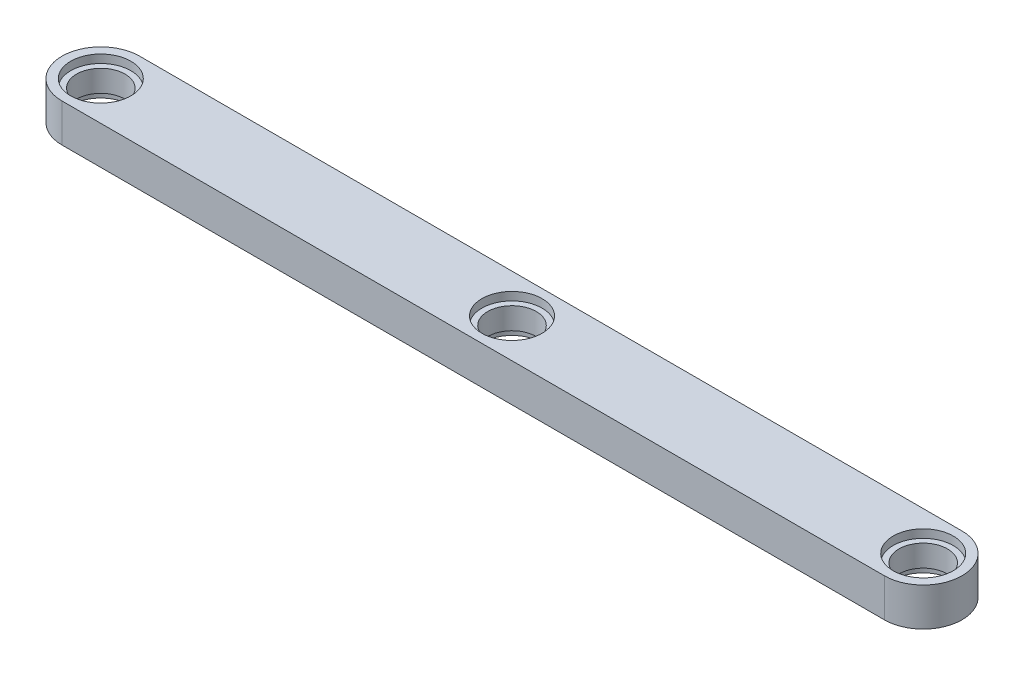
ISO-10303-21;
HEADER;
FILE_DESCRIPTION(('STEP AP214'),'2;1');
FILE_NAME('part.step','',(''),(''),'','','');
FILE_SCHEMA(('AUTOMOTIVE_DESIGN { 1 0 10303 214 1 1 1 1 }'));
ENDSEC;
DATA;
#1=APPLICATION_CONTEXT('core data for automotive mechanical design processes');
#2=APPLICATION_PROTOCOL_DEFINITION('international standard','automotive_design',2000,#1);
#3=PRODUCT_CONTEXT('',#1,'mechanical');
#4=PRODUCT('Part','Part','',(#3));
#5=PRODUCT_RELATED_PRODUCT_CATEGORY('part','',(#4));
#6=PRODUCT_DEFINITION_FORMATION('','',#4);
#7=PRODUCT_DEFINITION_CONTEXT('part definition',#1,'design');
#8=PRODUCT_DEFINITION('design','',#6,#7);
#9=PRODUCT_DEFINITION_SHAPE('','',#8);
#10=(LENGTH_UNIT() NAMED_UNIT(*) SI_UNIT(.MILLI.,.METRE.));
#11=(NAMED_UNIT(*) PLANE_ANGLE_UNIT() SI_UNIT($,.RADIAN.));
#12=(NAMED_UNIT(*) SI_UNIT($,.STERADIAN.) SOLID_ANGLE_UNIT());
#13=UNCERTAINTY_MEASURE_WITH_UNIT(LENGTH_MEASURE(1.E-05),#10,'distance_accuracy_value','');
#14=(GEOMETRIC_REPRESENTATION_CONTEXT(3) GLOBAL_UNCERTAINTY_ASSIGNED_CONTEXT((#13)) GLOBAL_UNIT_ASSIGNED_CONTEXT((#10,
#11,#12)) REPRESENTATION_CONTEXT('',''));
#15=CARTESIAN_POINT('',(0.,0.,0.));
#16=DIRECTION('',(0.,0.,1.));
#17=DIRECTION('',(1.,0.,0.));
#18=AXIS2_PLACEMENT_3D('',#15,#16,#17);
#19=CARTESIAN_POINT('',(0.,3.935,0.));
#20=DIRECTION('',(0.,-1.,0.));
#21=DIRECTION('',(0.,0.,-1.));
#22=AXIS2_PLACEMENT_3D('',#19,#20,#21);
#23=CYLINDRICAL_SURFACE('',#22,3.1);
#24=CARTESIAN_POINT('',(0.,0.,0.));
#25=DIRECTION('',(0.,1.,0.));
#26=DIRECTION('',(0.,0.,1.));
#27=AXIS2_PLACEMENT_3D('',#24,#25,#26);
#28=CIRCLE('',#27,3.1);
#29=CARTESIAN_POINT('',(0.,0.,3.1));
#30=VERTEX_POINT('',#29);
#31=EDGE_CURVE('E117',#30,#30,#28,.T.);
#32=ORIENTED_EDGE('',*,*,#31,.F.);
#33=EDGE_LOOP('',(#32));
#34=FACE_BOUND('',#33,.T.);
#35=CARTESIAN_POINT('',(0.,0.85,0.));
#36=DIRECTION('',(0.,1.,0.));
#37=DIRECTION('',(0.,0.,1.));
#38=AXIS2_PLACEMENT_3D('',#35,#36,#37);
#39=CIRCLE('',#38,3.1);
#40=CARTESIAN_POINT('',(0.,0.85,3.1));
#41=VERTEX_POINT('',#40);
#42=EDGE_CURVE('E175',#41,#41,#39,.T.);
#43=ORIENTED_EDGE('',*,*,#42,.T.);
#44=EDGE_LOOP('',(#43));
#45=FACE_BOUND('',#44,.T.);
#46=ADVANCED_FACE('F43',(#34,#45),#23,.F.);
#47=CARTESIAN_POINT('',(84.76,3.935,0.));
#48=DIRECTION('',(0.,-1.,0.));
#49=DIRECTION('',(0.,0.,-1.));
#50=AXIS2_PLACEMENT_3D('',#47,#48,#49);
#51=CYLINDRICAL_SURFACE('',#50,3.1);
#52=CARTESIAN_POINT('',(84.76,0.,0.));
#53=DIRECTION('',(0.,1.,0.));
#54=DIRECTION('',(0.,0.,1.));
#55=AXIS2_PLACEMENT_3D('',#52,#53,#54);
#56=CIRCLE('',#55,3.1);
#57=CARTESIAN_POINT('',(84.76,0.,3.1));
#58=VERTEX_POINT('',#57);
#59=EDGE_CURVE('E114',#58,#58,#56,.T.);
#60=ORIENTED_EDGE('',*,*,#59,.F.);
#61=EDGE_LOOP('',(#60));
#62=FACE_BOUND('',#61,.T.);
#63=CARTESIAN_POINT('',(84.76,0.85,0.));
#64=DIRECTION('',(0.,1.,0.));
#65=DIRECTION('',(0.,0.,1.));
#66=AXIS2_PLACEMENT_3D('',#63,#64,#65);
#67=CIRCLE('',#66,3.1);
#68=CARTESIAN_POINT('',(84.76,0.85,3.1));
#69=VERTEX_POINT('',#68);
#70=EDGE_CURVE('E167',#69,#69,#67,.T.);
#71=ORIENTED_EDGE('',*,*,#70,.T.);
#72=EDGE_LOOP('',(#71));
#73=FACE_BOUND('',#72,.T.);
#74=ADVANCED_FACE('F142',(#62,#73),#51,.F.);
#75=CARTESIAN_POINT('',(42.38,3.935,0.));
#76=DIRECTION('',(0.,-1.,0.));
#77=DIRECTION('',(0.,0.,-1.));
#78=AXIS2_PLACEMENT_3D('',#75,#76,#77);
#79=CYLINDRICAL_SURFACE('',#78,3.09999999999999);
#80=CARTESIAN_POINT('',(42.38,0.,0.));
#81=DIRECTION('',(0.,1.,0.));
#82=DIRECTION('',(0.,0.,1.));
#83=AXIS2_PLACEMENT_3D('',#80,#81,#82);
#84=CIRCLE('',#83,3.09999999999999);
#85=CARTESIAN_POINT('',(42.38,0.,3.09999999999999));
#86=VERTEX_POINT('',#85);
#87=EDGE_CURVE('E109',#86,#86,#84,.T.);
#88=ORIENTED_EDGE('',*,*,#87,.F.);
#89=EDGE_LOOP('',(#88));
#90=FACE_BOUND('',#89,.T.);
#91=CARTESIAN_POINT('',(42.38,0.85,0.));
#92=DIRECTION('',(0.,1.,0.));
#93=DIRECTION('',(0.,0.,1.));
#94=AXIS2_PLACEMENT_3D('',#91,#92,#93);
#95=CIRCLE('',#94,3.09999999999999);
#96=CARTESIAN_POINT('',(42.38,0.85,3.09999999999999));
#97=VERTEX_POINT('',#96);
#98=EDGE_CURVE('E160',#97,#97,#95,.T.);
#99=ORIENTED_EDGE('',*,*,#98,.T.);
#100=EDGE_LOOP('',(#99));
#101=FACE_BOUND('',#100,.T.);
#102=ADVANCED_FACE('F223',(#90,#101),#79,.F.);
#103=CARTESIAN_POINT('',(0.,3.935,4.));
#104=DIRECTION('',(0.,0.,-1.));
#105=DIRECTION('',(-1.,0.,0.));
#106=AXIS2_PLACEMENT_3D('',#103,#104,#105);
#107=PLANE('',#106);
#108=DIRECTION('',(1.,0.,0.));
#109=VECTOR('',#108,1.);
#110=CARTESIAN_POINT('',(0.,0.,4.));
#111=LINE('',#110,#109);
#112=CARTESIAN_POINT('',(0.,0.,4.));
#113=VERTEX_POINT('',#112);
#114=CARTESIAN_POINT('',(84.76,0.,4.));
#115=VERTEX_POINT('',#114);
#116=EDGE_CURVE('E120',#113,#115,#111,.T.);
#117=ORIENTED_EDGE('',*,*,#116,.T.);
#118=DIRECTION('',(0.,-1.,0.));
#119=VECTOR('',#118,1.);
#120=CARTESIAN_POINT('',(84.76,3.935,4.));
#121=LINE('',#120,#119);
#122=CARTESIAN_POINT('',(84.76,3.935,4.));
#123=VERTEX_POINT('',#122);
#124=EDGE_CURVE('E105',#123,#115,#121,.T.);
#125=ORIENTED_EDGE('',*,*,#124,.F.);
#126=DIRECTION('',(1.,0.,0.));
#127=VECTOR('',#126,1.);
#128=CARTESIAN_POINT('',(0.,3.935,4.));
#129=LINE('',#128,#127);
#130=CARTESIAN_POINT('',(0.,3.935,4.));
#131=VERTEX_POINT('',#130);
#132=EDGE_CURVE('E95',#131,#123,#129,.T.);
#133=ORIENTED_EDGE('',*,*,#132,.F.);
#134=DIRECTION('',(0.,-1.,0.));
#135=VECTOR('',#134,1.);
#136=CARTESIAN_POINT('',(0.,3.935,4.));
#137=LINE('',#136,#135);
#138=EDGE_CURVE('E106',#131,#113,#137,.T.);
#139=ORIENTED_EDGE('',*,*,#138,.T.);
#140=EDGE_LOOP('',(#117,#125,#133,#139));
#141=FACE_BOUND('',#140,.T.);
#142=ADVANCED_FACE('F228',(#141),#107,.F.);
#143=CARTESIAN_POINT('',(84.76,3.935,0.));
#144=DIRECTION('',(0.,-1.,0.));
#145=DIRECTION('',(0.,0.,-1.));
#146=AXIS2_PLACEMENT_3D('',#143,#144,#145);
#147=CYLINDRICAL_SURFACE('',#146,4.);
#148=CARTESIAN_POINT('',(84.76,0.,0.));
#149=DIRECTION('',(0.,1.,0.));
#150=DIRECTION('',(0.,0.,1.));
#151=AXIS2_PLACEMENT_3D('',#148,#149,#150);
#152=CIRCLE('',#151,4.);
#153=CARTESIAN_POINT('',(84.76,0.,-4.));
#154=VERTEX_POINT('',#153);
#155=EDGE_CURVE('E98',#115,#154,#152,.T.);
#156=ORIENTED_EDGE('',*,*,#155,.T.);
#157=DIRECTION('',(0.,-1.,0.));
#158=VECTOR('',#157,1.);
#159=CARTESIAN_POINT('',(84.76,3.935,-4.));
#160=LINE('',#159,#158);
#161=CARTESIAN_POINT('',(84.76,3.935,-4.));
#162=VERTEX_POINT('',#161);
#163=EDGE_CURVE('E96',#162,#154,#160,.T.);
#164=ORIENTED_EDGE('',*,*,#163,.F.);
#165=CARTESIAN_POINT('',(84.76,3.935,0.));
#166=DIRECTION('',(0.,1.,0.));
#167=DIRECTION('',(0.,0.,1.));
#168=AXIS2_PLACEMENT_3D('',#165,#166,#167);
#169=CIRCLE('',#168,4.);
#170=EDGE_CURVE('E87',#123,#162,#169,.T.);
#171=ORIENTED_EDGE('',*,*,#170,.F.);
#172=ORIENTED_EDGE('',*,*,#124,.T.);
#173=EDGE_LOOP('',(#156,#164,#171,#172));
#174=FACE_BOUND('',#173,.T.);
#175=ADVANCED_FACE('F100',(#174),#147,.T.);
#176=CARTESIAN_POINT('',(0.,3.935,-4.));
#177=DIRECTION('',(0.,0.,-1.));
#178=DIRECTION('',(-1.,0.,0.));
#179=AXIS2_PLACEMENT_3D('',#176,#177,#178);
#180=PLANE('',#179);
#181=DIRECTION('',(1.,0.,0.));
#182=VECTOR('',#181,1.);
#183=CARTESIAN_POINT('',(0.,0.,-4.));
#184=LINE('',#183,#182);
#185=CARTESIAN_POINT('',(0.,0.,-4.));
#186=VERTEX_POINT('',#185);
#187=EDGE_CURVE('E124',#186,#154,#184,.T.);
#188=ORIENTED_EDGE('',*,*,#187,.F.);
#189=DIRECTION('',(0.,-1.,0.));
#190=VECTOR('',#189,1.);
#191=CARTESIAN_POINT('',(0.,3.935,-4.));
#192=LINE('',#191,#190);
#193=CARTESIAN_POINT('',(0.,3.935,-4.));
#194=VERTEX_POINT('',#193);
#195=EDGE_CURVE('E76',#194,#186,#192,.T.);
#196=ORIENTED_EDGE('',*,*,#195,.F.);
#197=DIRECTION('',(1.,0.,0.));
#198=VECTOR('',#197,1.);
#199=CARTESIAN_POINT('',(0.,3.935,-4.));
#200=LINE('',#199,#198);
#201=EDGE_CURVE('E89',#194,#162,#200,.T.);
#202=ORIENTED_EDGE('',*,*,#201,.T.);
#203=ORIENTED_EDGE('',*,*,#163,.T.);
#204=EDGE_LOOP('',(#188,#196,#202,#203));
#205=FACE_BOUND('',#204,.T.);
#206=ADVANCED_FACE('F102',(#205),#180,.T.);
#207=CARTESIAN_POINT('',(0.,3.085,0.));
#208=DIRECTION('',(0.,1.,0.));
#209=DIRECTION('',(0.,0.,1.));
#210=AXIS2_PLACEMENT_3D('',#207,#208,#209);
#211=CIRCLE('',#210,3.1);
#212=CARTESIAN_POINT('',(0.,3.085,3.1));
#213=VERTEX_POINT('',#212);
#214=EDGE_CURVE('E12',#213,#213,#211,.T.);
#215=ORIENTED_EDGE('',*,*,#214,.F.);
#216=EDGE_LOOP('',(#215));
#217=FACE_BOUND('',#216,.T.);
#218=CARTESIAN_POINT('',(0.,3.935,0.));
#219=DIRECTION('',(0.,1.,0.));
#220=DIRECTION('',(0.,0.,1.));
#221=AXIS2_PLACEMENT_3D('',#218,#219,#220);
#222=CIRCLE('',#221,3.1);
#223=CARTESIAN_POINT('',(0.,3.935,3.1));
#224=VERTEX_POINT('',#223);
#225=EDGE_CURVE('E150',#224,#224,#222,.T.);
#226=ORIENTED_EDGE('',*,*,#225,.T.);
#227=EDGE_LOOP('',(#226));
#228=FACE_BOUND('',#227,.T.);
#229=ADVANCED_FACE('F143',(#217,#228),#23,.F.);
#230=CARTESIAN_POINT('',(84.76,3.085,0.));
#231=DIRECTION('',(0.,1.,0.));
#232=DIRECTION('',(0.,0.,1.));
#233=AXIS2_PLACEMENT_3D('',#230,#231,#232);
#234=CIRCLE('',#233,3.1);
#235=CARTESIAN_POINT('',(84.76,3.085,3.1));
#236=VERTEX_POINT('',#235);
#237=EDGE_CURVE('E55',#236,#236,#234,.T.);
#238=ORIENTED_EDGE('',*,*,#237,.F.);
#239=EDGE_LOOP('',(#238));
#240=FACE_BOUND('',#239,.T.);
#241=CARTESIAN_POINT('',(84.76,3.935,0.));
#242=DIRECTION('',(0.,1.,0.));
#243=DIRECTION('',(0.,0.,1.));
#244=AXIS2_PLACEMENT_3D('',#241,#242,#243);
#245=CIRCLE('',#244,3.1);
#246=CARTESIAN_POINT('',(84.76,3.935,3.1));
#247=VERTEX_POINT('',#246);
#248=EDGE_CURVE('E144',#247,#247,#245,.T.);
#249=ORIENTED_EDGE('',*,*,#248,.T.);
#250=EDGE_LOOP('',(#249));
#251=FACE_BOUND('',#250,.T.);
#252=ADVANCED_FACE('F136',(#240,#251),#51,.F.);
#253=CARTESIAN_POINT('',(42.38,3.085,0.));
#254=DIRECTION('',(0.,1.,0.));
#255=DIRECTION('',(0.,0.,1.));
#256=AXIS2_PLACEMENT_3D('',#253,#254,#255);
#257=CIRCLE('',#256,3.09999999999999);
#258=CARTESIAN_POINT('',(42.38,3.085,3.09999999999999));
#259=VERTEX_POINT('',#258);
#260=EDGE_CURVE('E131',#259,#259,#257,.T.);
#261=ORIENTED_EDGE('',*,*,#260,.F.);
#262=EDGE_LOOP('',(#261));
#263=FACE_BOUND('',#262,.T.);
#264=CARTESIAN_POINT('',(42.38,3.935,0.));
#265=DIRECTION('',(0.,1.,0.));
#266=DIRECTION('',(0.,0.,1.));
#267=AXIS2_PLACEMENT_3D('',#264,#265,#266);
#268=CIRCLE('',#267,3.09999999999999);
#269=CARTESIAN_POINT('',(42.38,3.935,3.09999999999999));
#270=VERTEX_POINT('',#269);
#271=EDGE_CURVE('E130',#270,#270,#268,.T.);
#272=ORIENTED_EDGE('',*,*,#271,.T.);
#273=EDGE_LOOP('',(#272));
#274=FACE_BOUND('',#273,.T.);
#275=ADVANCED_FACE('F44',(#263,#274),#79,.F.);
#276=CARTESIAN_POINT('',(0.,3.935,0.));
#277=DIRECTION('',(0.,-1.,0.));
#278=DIRECTION('',(0.,0.,-1.));
#279=AXIS2_PLACEMENT_3D('',#276,#277,#278);
#280=CYLINDRICAL_SURFACE('',#279,4.);
#281=CARTESIAN_POINT('',(0.,0.,0.));
#282=DIRECTION('',(0.,1.,0.));
#283=DIRECTION('',(0.,0.,1.));
#284=AXIS2_PLACEMENT_3D('',#281,#282,#283);
#285=CIRCLE('',#284,4.);
#286=EDGE_CURVE('E78',#186,#113,#285,.T.);
#287=ORIENTED_EDGE('',*,*,#286,.T.);
#288=ORIENTED_EDGE('',*,*,#138,.F.);
#289=CARTESIAN_POINT('',(0.,3.935,0.));
#290=DIRECTION('',(0.,1.,0.));
#291=DIRECTION('',(0.,0.,1.));
#292=AXIS2_PLACEMENT_3D('',#289,#290,#291);
#293=CIRCLE('',#292,4.);
#294=EDGE_CURVE('E58',#194,#131,#293,.T.);
#295=ORIENTED_EDGE('',*,*,#294,.F.);
#296=ORIENTED_EDGE('',*,*,#195,.T.);
#297=EDGE_LOOP('',(#287,#288,#295,#296));
#298=FACE_BOUND('',#297,.T.);
#299=ADVANCED_FACE('F210',(#298),#280,.T.);
#300=CARTESIAN_POINT('',(0.,3.935,0.));
#301=DIRECTION('',(0.,1.,0.));
#302=DIRECTION('',(0.,0.,1.));
#303=AXIS2_PLACEMENT_3D('',#300,#301,#302);
#304=PLANE('',#303);
#305=ORIENTED_EDGE('',*,*,#271,.F.);
#306=EDGE_LOOP('',(#305));
#307=FACE_BOUND('',#306,.T.);
#308=ORIENTED_EDGE('',*,*,#248,.F.);
#309=EDGE_LOOP('',(#308));
#310=FACE_BOUND('',#309,.T.);
#311=ORIENTED_EDGE('',*,*,#225,.F.);
#312=EDGE_LOOP('',(#311));
#313=FACE_BOUND('',#312,.T.);
#314=ORIENTED_EDGE('',*,*,#132,.T.);
#315=ORIENTED_EDGE('',*,*,#170,.T.);
#316=ORIENTED_EDGE('',*,*,#201,.F.);
#317=ORIENTED_EDGE('',*,*,#294,.T.);
#318=EDGE_LOOP('',(#314,#315,#316,#317));
#319=FACE_BOUND('',#318,.T.);
#320=ADVANCED_FACE('F86',(#307,#310,#313,#319),#304,.T.);
#321=CARTESIAN_POINT('',(0.,0.,0.));
#322=DIRECTION('',(0.,1.,0.));
#323=DIRECTION('',(0.,0.,1.));
#324=AXIS2_PLACEMENT_3D('',#321,#322,#323);
#325=PLANE('',#324);
#326=ORIENTED_EDGE('',*,*,#87,.T.);
#327=EDGE_LOOP('',(#326));
#328=FACE_BOUND('',#327,.T.);
#329=ORIENTED_EDGE('',*,*,#59,.T.);
#330=EDGE_LOOP('',(#329));
#331=FACE_BOUND('',#330,.T.);
#332=ORIENTED_EDGE('',*,*,#31,.T.);
#333=EDGE_LOOP('',(#332));
#334=FACE_BOUND('',#333,.T.);
#335=ORIENTED_EDGE('',*,*,#116,.F.);
#336=ORIENTED_EDGE('',*,*,#286,.F.);
#337=ORIENTED_EDGE('',*,*,#187,.T.);
#338=ORIENTED_EDGE('',*,*,#155,.F.);
#339=EDGE_LOOP('',(#335,#336,#337,#338));
#340=FACE_BOUND('',#339,.T.);
#341=ADVANCED_FACE('F206',(#328,#331,#334,#340),#325,.F.);
#342=CARTESIAN_POINT('',(42.38,12.7031240867132,0.));
#343=DIRECTION('',(0.,-1.,0.));
#344=DIRECTION('',(0.,0.,-1.));
#345=AXIS2_PLACEMENT_3D('',#342,#343,#344);
#346=CYLINDRICAL_SURFACE('',#345,2.5);
#347=CARTESIAN_POINT('',(42.38,0.85,0.));
#348=DIRECTION('',(0.,1.,0.));
#349=DIRECTION('',(0.,0.,1.));
#350=AXIS2_PLACEMENT_3D('',#347,#348,#349);
#351=CIRCLE('',#350,2.5);
#352=CARTESIAN_POINT('',(42.38,0.85,2.5));
#353=VERTEX_POINT('',#352);
#354=EDGE_CURVE('E158',#353,#353,#351,.T.);
#355=ORIENTED_EDGE('',*,*,#354,.F.);
#356=EDGE_LOOP('',(#355));
#357=FACE_BOUND('',#356,.T.);
#358=CARTESIAN_POINT('',(42.38,3.085,0.));
#359=DIRECTION('',(0.,1.,0.));
#360=DIRECTION('',(0.,0.,1.));
#361=AXIS2_PLACEMENT_3D('',#358,#359,#360);
#362=CIRCLE('',#361,2.5);
#363=CARTESIAN_POINT('',(42.38,3.085,2.5));
#364=VERTEX_POINT('',#363);
#365=EDGE_CURVE('E152',#364,#364,#362,.T.);
#366=ORIENTED_EDGE('',*,*,#365,.T.);
#367=EDGE_LOOP('',(#366));
#368=FACE_BOUND('',#367,.T.);
#369=ADVANCED_FACE('F212',(#357,#368),#346,.F.);
#370=CARTESIAN_POINT('',(0.,0.85,0.));
#371=DIRECTION('',(0.,1.,0.));
#372=DIRECTION('',(0.,0.,1.));
#373=AXIS2_PLACEMENT_3D('',#370,#371,#372);
#374=PLANE('',#373);
#375=ORIENTED_EDGE('',*,*,#354,.T.);
#376=EDGE_LOOP('',(#375));
#377=FACE_BOUND('',#376,.T.);
#378=ORIENTED_EDGE('',*,*,#98,.F.);
#379=EDGE_LOOP('',(#378));
#380=FACE_BOUND('',#379,.T.);
#381=ADVANCED_FACE('F287',(#377,#380),#374,.F.);
#382=CARTESIAN_POINT('',(0.,3.085,0.));
#383=DIRECTION('',(0.,1.,0.));
#384=DIRECTION('',(0.,0.,1.));
#385=AXIS2_PLACEMENT_3D('',#382,#383,#384);
#386=PLANE('',#385);
#387=ORIENTED_EDGE('',*,*,#365,.F.);
#388=EDGE_LOOP('',(#387));
#389=FACE_BOUND('',#388,.T.);
#390=ORIENTED_EDGE('',*,*,#260,.T.);
#391=EDGE_LOOP('',(#390));
#392=FACE_BOUND('',#391,.T.);
#393=ADVANCED_FACE('F300',(#389,#392),#386,.T.);
#394=CARTESIAN_POINT('',(84.76,12.7031240867132,0.));
#395=DIRECTION('',(0.,-1.,0.));
#396=DIRECTION('',(0.,0.,-1.));
#397=AXIS2_PLACEMENT_3D('',#394,#395,#396);
#398=CYLINDRICAL_SURFACE('',#397,2.5);
#399=CARTESIAN_POINT('',(84.76,0.85,0.));
#400=DIRECTION('',(0.,1.,0.));
#401=DIRECTION('',(0.,0.,1.));
#402=AXIS2_PLACEMENT_3D('',#399,#400,#401);
#403=CIRCLE('',#402,2.5);
#404=CARTESIAN_POINT('',(84.76,0.85,2.5));
#405=VERTEX_POINT('',#404);
#406=EDGE_CURVE('E170',#405,#405,#403,.T.);
#407=ORIENTED_EDGE('',*,*,#406,.F.);
#408=EDGE_LOOP('',(#407));
#409=FACE_BOUND('',#408,.T.);
#410=CARTESIAN_POINT('',(84.76,3.085,0.));
#411=DIRECTION('',(0.,1.,0.));
#412=DIRECTION('',(0.,0.,1.));
#413=AXIS2_PLACEMENT_3D('',#410,#411,#412);
#414=CIRCLE('',#413,2.5);
#415=CARTESIAN_POINT('',(84.76,3.085,2.5));
#416=VERTEX_POINT('',#415);
#417=EDGE_CURVE('E161',#416,#416,#414,.T.);
#418=ORIENTED_EDGE('',*,*,#417,.T.);
#419=EDGE_LOOP('',(#418));
#420=FACE_BOUND('',#419,.T.);
#421=ADVANCED_FACE('F311',(#409,#420),#398,.F.);
#422=CARTESIAN_POINT('',(0.,0.85,0.));
#423=DIRECTION('',(0.,1.,0.));
#424=DIRECTION('',(0.,0.,1.));
#425=AXIS2_PLACEMENT_3D('',#422,#423,#424);
#426=PLANE('',#425);
#427=ORIENTED_EDGE('',*,*,#406,.T.);
#428=EDGE_LOOP('',(#427));
#429=FACE_BOUND('',#428,.T.);
#430=ORIENTED_EDGE('',*,*,#70,.F.);
#431=EDGE_LOOP('',(#430));
#432=FACE_BOUND('',#431,.T.);
#433=ADVANCED_FACE('F325',(#429,#432),#426,.F.);
#434=CARTESIAN_POINT('',(0.,3.085,0.));
#435=DIRECTION('',(0.,1.,0.));
#436=DIRECTION('',(0.,0.,1.));
#437=AXIS2_PLACEMENT_3D('',#434,#435,#436);
#438=PLANE('',#437);
#439=ORIENTED_EDGE('',*,*,#417,.F.);
#440=EDGE_LOOP('',(#439));
#441=FACE_BOUND('',#440,.T.);
#442=ORIENTED_EDGE('',*,*,#237,.T.);
#443=EDGE_LOOP('',(#442));
#444=FACE_BOUND('',#443,.T.);
#445=ADVANCED_FACE('F138',(#441,#444),#438,.T.);
#446=CARTESIAN_POINT('',(0.,0.85,0.));
#447=DIRECTION('',(0.,1.,0.));
#448=DIRECTION('',(0.,0.,1.));
#449=AXIS2_PLACEMENT_3D('',#446,#447,#448);
#450=PLANE('',#449);
#451=ORIENTED_EDGE('',*,*,#42,.F.);
#452=EDGE_LOOP('',(#451));
#453=FACE_BOUND('',#452,.T.);
#454=CARTESIAN_POINT('',(0.,0.85,0.));
#455=DIRECTION('',(0.,1.,0.));
#456=DIRECTION('',(0.,0.,1.));
#457=AXIS2_PLACEMENT_3D('',#454,#455,#456);
#458=CIRCLE('',#457,2.5);
#459=CARTESIAN_POINT('',(0.,0.85,2.5));
#460=VERTEX_POINT('',#459);
#461=EDGE_CURVE('E111',#460,#460,#458,.T.);
#462=ORIENTED_EDGE('',*,*,#461,.T.);
#463=EDGE_LOOP('',(#462));
#464=FACE_BOUND('',#463,.T.);
#465=ADVANCED_FACE('F185',(#453,#464),#450,.F.);
#466=CARTESIAN_POINT('',(0.,12.7031240867132,0.));
#467=DIRECTION('',(0.,-1.,0.));
#468=DIRECTION('',(0.,0.,-1.));
#469=AXIS2_PLACEMENT_3D('',#466,#467,#468);
#470=CYLINDRICAL_SURFACE('',#469,2.5);
#471=ORIENTED_EDGE('',*,*,#461,.F.);
#472=EDGE_LOOP('',(#471));
#473=FACE_BOUND('',#472,.T.);
#474=CARTESIAN_POINT('',(0.,3.085,0.));
#475=DIRECTION('',(0.,1.,0.));
#476=DIRECTION('',(0.,0.,1.));
#477=AXIS2_PLACEMENT_3D('',#474,#475,#476);
#478=CIRCLE('',#477,2.5);
#479=CARTESIAN_POINT('',(0.,3.085,2.5));
#480=VERTEX_POINT('',#479);
#481=EDGE_CURVE('E168',#480,#480,#478,.T.);
#482=ORIENTED_EDGE('',*,*,#481,.T.);
#483=EDGE_LOOP('',(#482));
#484=FACE_BOUND('',#483,.T.);
#485=ADVANCED_FACE('F183',(#473,#484),#470,.F.);
#486=CARTESIAN_POINT('',(0.,3.085,0.));
#487=DIRECTION('',(0.,1.,0.));
#488=DIRECTION('',(0.,0.,1.));
#489=AXIS2_PLACEMENT_3D('',#486,#487,#488);
#490=PLANE('',#489);
#491=ORIENTED_EDGE('',*,*,#481,.F.);
#492=EDGE_LOOP('',(#491));
#493=FACE_BOUND('',#492,.T.);
#494=ORIENTED_EDGE('',*,*,#214,.T.);
#495=EDGE_LOOP('',(#494));
#496=FACE_BOUND('',#495,.T.);
#497=ADVANCED_FACE('F193',(#493,#496),#490,.T.);
#498=CLOSED_SHELL('',(#46,#74,#102,#142,#175,#206,#229,#252,#275,#299,#320,#341,#369,#381,#393,
#421,#433,#445,#465,#485,#497));
#499=MANIFOLD_SOLID_BREP('B2',#498);
#500=ADVANCED_BREP_SHAPE_REPRESENTATION('',(#18,#499),#14);
#501=SHAPE_DEFINITION_REPRESENTATION(#9,#500);
ENDSEC;
END-ISO-10303-21;
